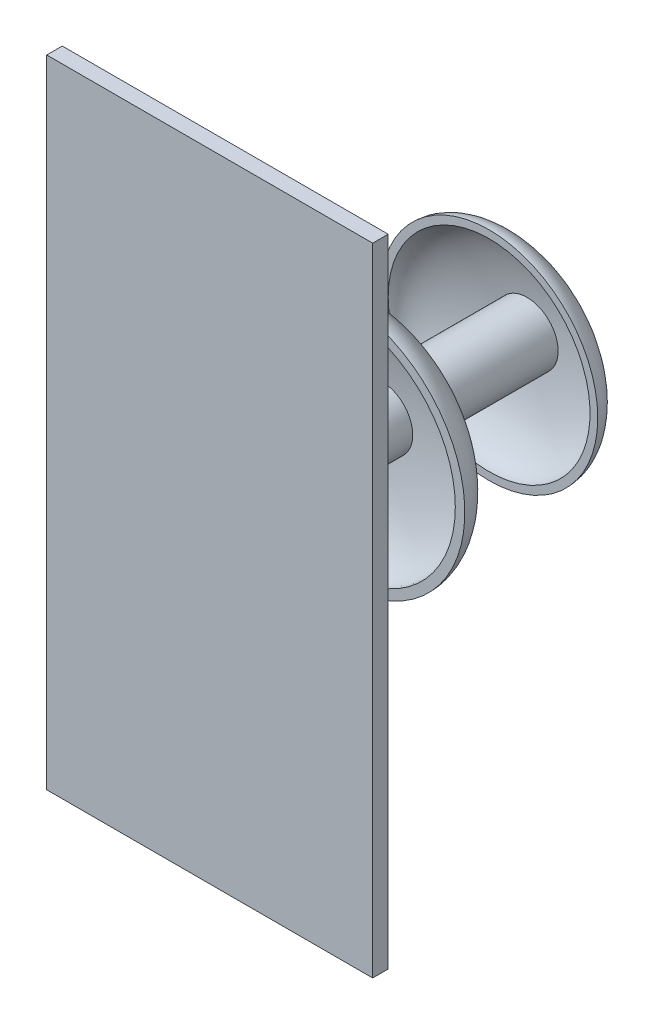
ISO-10303-21;
HEADER;
FILE_DESCRIPTION(('STEP AP214'),'2;1');
FILE_NAME('part.step','',(''),(''),'','','');
FILE_SCHEMA(('AUTOMOTIVE_DESIGN { 1 0 10303 214 1 1 1 1 }'));
ENDSEC;
DATA;
#1=APPLICATION_CONTEXT('core data for automotive mechanical design processes');
#2=APPLICATION_PROTOCOL_DEFINITION('international standard','automotive_design',2000,#1);
#3=PRODUCT_CONTEXT('',#1,'mechanical');
#4=PRODUCT('Part','Part','',(#3));
#5=PRODUCT_RELATED_PRODUCT_CATEGORY('part','',(#4));
#6=PRODUCT_DEFINITION_FORMATION('','',#4);
#7=PRODUCT_DEFINITION_CONTEXT('part definition',#1,'design');
#8=PRODUCT_DEFINITION('design','',#6,#7);
#9=PRODUCT_DEFINITION_SHAPE('','',#8);
#10=(LENGTH_UNIT() NAMED_UNIT(*) SI_UNIT(.MILLI.,.METRE.));
#11=(NAMED_UNIT(*) PLANE_ANGLE_UNIT() SI_UNIT($,.RADIAN.));
#12=(NAMED_UNIT(*) SI_UNIT($,.STERADIAN.) SOLID_ANGLE_UNIT());
#13=UNCERTAINTY_MEASURE_WITH_UNIT(LENGTH_MEASURE(1.E-05),#10,'distance_accuracy_value','');
#14=(GEOMETRIC_REPRESENTATION_CONTEXT(3) GLOBAL_UNCERTAINTY_ASSIGNED_CONTEXT((#13)) GLOBAL_UNIT_ASSIGNED_CONTEXT((#10,
#11,#12)) REPRESENTATION_CONTEXT('',''));
#15=CARTESIAN_POINT('',(0.,0.,0.));
#16=DIRECTION('',(0.,0.,1.));
#17=DIRECTION('',(1.,0.,0.));
#18=AXIS2_PLACEMENT_3D('',#15,#16,#17);
#19=CARTESIAN_POINT('',(0.,0.,0.1));
#20=DIRECTION('',(1.,0.,0.));
#21=DIRECTION('',(0.,1.,0.));
#22=AXIS2_PLACEMENT_3D('',#19,#20,#21);
#23=PLANE('',#22);
#24=DIRECTION('',(0.,-1.,0.));
#25=VECTOR('',#24,1.);
#26=CARTESIAN_POINT('',(0.,0.,0.));
#27=LINE('',#26,#25);
#28=CARTESIAN_POINT('',(0.,4.1,0.));
#29=VERTEX_POINT('',#28);
#30=CARTESIAN_POINT('',(0.,0.,0.));
#31=VERTEX_POINT('',#30);
#32=EDGE_CURVE('E124',#29,#31,#27,.T.);
#33=ORIENTED_EDGE('',*,*,#32,.T.);
#34=DIRECTION('',(0.,0.,-1.));
#35=VECTOR('',#34,1.);
#36=CARTESIAN_POINT('',(0.,0.,0.1));
#37=LINE('',#36,#35);
#38=CARTESIAN_POINT('',(0.,0.,0.1));
#39=VERTEX_POINT('',#38);
#40=EDGE_CURVE('E11',#39,#31,#37,.T.);
#41=ORIENTED_EDGE('',*,*,#40,.F.);
#42=DIRECTION('',(0.,-1.,0.));
#43=VECTOR('',#42,1.);
#44=CARTESIAN_POINT('',(0.,0.,0.1));
#45=LINE('',#44,#43);
#46=CARTESIAN_POINT('',(0.,4.1,0.1));
#47=VERTEX_POINT('',#46);
#48=EDGE_CURVE('E125',#47,#39,#45,.T.);
#49=ORIENTED_EDGE('',*,*,#48,.F.);
#50=DIRECTION('',(0.,0.,-1.));
#51=VECTOR('',#50,1.);
#52=CARTESIAN_POINT('',(0.,4.1,0.1));
#53=LINE('',#52,#51);
#54=EDGE_CURVE('E131',#47,#29,#53,.T.);
#55=ORIENTED_EDGE('',*,*,#54,.T.);
#56=EDGE_LOOP('',(#33,#41,#49,#55));
#57=FACE_BOUND('',#56,.T.);
#58=ADVANCED_FACE('F37',(#57),#23,.F.);
#59=CARTESIAN_POINT('',(0.,0.,0.1));
#60=DIRECTION('',(0.,1.,0.));
#61=DIRECTION('',(0.,0.,1.));
#62=AXIS2_PLACEMENT_3D('',#59,#60,#61);
#63=PLANE('',#62);
#64=DIRECTION('',(1.,0.,0.));
#65=VECTOR('',#64,1.);
#66=CARTESIAN_POINT('',(0.,0.,0.));
#67=LINE('',#66,#65);
#68=CARTESIAN_POINT('',(2.1,0.,0.));
#69=VERTEX_POINT('',#68);
#70=EDGE_CURVE('E134',#31,#69,#67,.T.);
#71=ORIENTED_EDGE('',*,*,#70,.T.);
#72=DIRECTION('',(0.,0.,-1.));
#73=VECTOR('',#72,1.);
#74=CARTESIAN_POINT('',(2.1,0.,0.1));
#75=LINE('',#74,#73);
#76=CARTESIAN_POINT('',(2.1,0.,0.1));
#77=VERTEX_POINT('',#76);
#78=EDGE_CURVE('E45',#77,#69,#75,.T.);
#79=ORIENTED_EDGE('',*,*,#78,.F.);
#80=DIRECTION('',(1.,0.,0.));
#81=VECTOR('',#80,1.);
#82=CARTESIAN_POINT('',(0.,0.,0.1));
#83=LINE('',#82,#81);
#84=EDGE_CURVE('E84',#39,#77,#83,.T.);
#85=ORIENTED_EDGE('',*,*,#84,.F.);
#86=ORIENTED_EDGE('',*,*,#40,.T.);
#87=EDGE_LOOP('',(#71,#79,#85,#86));
#88=FACE_BOUND('',#87,.T.);
#89=ADVANCED_FACE('F156',(#88),#63,.F.);
#90=CARTESIAN_POINT('',(2.1,0.,0.1));
#91=DIRECTION('',(-1.,0.,0.));
#92=DIRECTION('',(0.,-1.,0.));
#93=AXIS2_PLACEMENT_3D('',#90,#91,#92);
#94=PLANE('',#93);
#95=DIRECTION('',(0.,1.,0.));
#96=VECTOR('',#95,1.);
#97=CARTESIAN_POINT('',(2.1,0.,0.));
#98=LINE('',#97,#96);
#99=CARTESIAN_POINT('',(2.1,4.1,0.));
#100=VERTEX_POINT('',#99);
#101=EDGE_CURVE('E71',#69,#100,#98,.T.);
#102=ORIENTED_EDGE('',*,*,#101,.T.);
#103=DIRECTION('',(0.,0.,-1.));
#104=VECTOR('',#103,1.);
#105=CARTESIAN_POINT('',(2.1,4.1,0.1));
#106=LINE('',#105,#104);
#107=CARTESIAN_POINT('',(2.1,4.1,0.1));
#108=VERTEX_POINT('',#107);
#109=EDGE_CURVE('E139',#108,#100,#106,.T.);
#110=ORIENTED_EDGE('',*,*,#109,.F.);
#111=DIRECTION('',(0.,1.,0.));
#112=VECTOR('',#111,1.);
#113=CARTESIAN_POINT('',(2.1,0.,0.1));
#114=LINE('',#113,#112);
#115=EDGE_CURVE('E128',#77,#108,#114,.T.);
#116=ORIENTED_EDGE('',*,*,#115,.F.);
#117=ORIENTED_EDGE('',*,*,#78,.T.);
#118=EDGE_LOOP('',(#102,#110,#116,#117));
#119=FACE_BOUND('',#118,.T.);
#120=ADVANCED_FACE('F141',(#119),#94,.F.);
#121=CARTESIAN_POINT('',(0.,4.1,0.1));
#122=DIRECTION('',(0.,-1.,0.));
#123=DIRECTION('',(0.,0.,-1.));
#124=AXIS2_PLACEMENT_3D('',#121,#122,#123);
#125=PLANE('',#124);
#126=DIRECTION('',(-1.,0.,0.));
#127=VECTOR('',#126,1.);
#128=CARTESIAN_POINT('',(0.,4.1,0.));
#129=LINE('',#128,#127);
#130=EDGE_CURVE('E77',#100,#29,#129,.T.);
#131=ORIENTED_EDGE('',*,*,#130,.T.);
#132=ORIENTED_EDGE('',*,*,#54,.F.);
#133=DIRECTION('',(-1.,0.,0.));
#134=VECTOR('',#133,1.);
#135=CARTESIAN_POINT('',(0.,4.1,0.1));
#136=LINE('',#135,#134);
#137=EDGE_CURVE('E53',#108,#47,#136,.T.);
#138=ORIENTED_EDGE('',*,*,#137,.F.);
#139=ORIENTED_EDGE('',*,*,#109,.T.);
#140=EDGE_LOOP('',(#131,#132,#138,#139));
#141=FACE_BOUND('',#140,.T.);
#142=ADVANCED_FACE('F147',(#141),#125,.F.);
#143=CARTESIAN_POINT('',(0.,0.,0.1));
#144=DIRECTION('',(0.,0.,-1.));
#145=DIRECTION('',(-1.,0.,0.));
#146=AXIS2_PLACEMENT_3D('',#143,#144,#145);
#147=PLANE('',#146);
#148=ORIENTED_EDGE('',*,*,#48,.T.);
#149=ORIENTED_EDGE('',*,*,#84,.T.);
#150=ORIENTED_EDGE('',*,*,#115,.T.);
#151=ORIENTED_EDGE('',*,*,#137,.T.);
#152=EDGE_LOOP('',(#148,#149,#150,#151));
#153=FACE_BOUND('',#152,.T.);
#154=ADVANCED_FACE('F149',(#153),#147,.F.);
#155=CARTESIAN_POINT('',(0.,0.,0.));
#156=DIRECTION('',(0.,0.,-1.));
#157=DIRECTION('',(-1.,0.,0.));
#158=AXIS2_PLACEMENT_3D('',#155,#156,#157);
#159=PLANE('',#158);
#160=CARTESIAN_POINT('',(1.05,2.05,0.));
#161=DIRECTION('',(0.,0.,-1.));
#162=DIRECTION('',(-1.,0.,0.));
#163=AXIS2_PLACEMENT_3D('',#160,#161,#162);
#164=CIRCLE('',#163,0.2);
#165=CARTESIAN_POINT('',(0.849999999999999,2.05,0.));
#166=VERTEX_POINT('',#165);
#167=EDGE_CURVE('E121',#166,#166,#164,.T.);
#168=ORIENTED_EDGE('',*,*,#167,.F.);
#169=EDGE_LOOP('',(#168));
#170=FACE_BOUND('',#169,.T.);
#171=ORIENTED_EDGE('',*,*,#32,.F.);
#172=ORIENTED_EDGE('',*,*,#130,.F.);
#173=ORIENTED_EDGE('',*,*,#101,.F.);
#174=ORIENTED_EDGE('',*,*,#70,.F.);
#175=EDGE_LOOP('',(#171,#172,#173,#174));
#176=FACE_BOUND('',#175,.T.);
#177=ADVANCED_FACE('F92',(#170,#176),#159,.T.);
#178=CARTESIAN_POINT('',(1.05,2.05,-1.7));
#179=DIRECTION('',(0.,1.,0.));
#180=DIRECTION('',(1.,0.,0.));
#181=AXIS2_PLACEMENT_3D('',#178,#179,#180);
#182=ELLIPSE('',#181,0.7,0.3);
#183=TRIMMED_CURVE('',#182,(PARAMETER_VALUE(-1.5707963267949)),
(PARAMETER_VALUE(1.5707963267949)),.T.,.PARAMETER.);
#184=CARTESIAN_POINT('',(1.05,2.05,-2.));
#185=DIRECTION('',(0.,0.,-1.));
#186=AXIS1_PLACEMENT('',#184,#185);
#187=SURFACE_OF_REVOLUTION('',#183,#186);
#188=CARTESIAN_POINT('',(1.05,2.05,-2.));
#189=VERTEX_POINT('',#188);
#190=VERTEX_LOOP('',#189);
#191=FACE_BOUND('',#190,.T.);
#192=CARTESIAN_POINT('',(1.05,2.05,-1.7));
#193=DIRECTION('',(0.,0.,-1.));
#194=DIRECTION('',(-1.,0.,0.));
#195=AXIS2_PLACEMENT_3D('',#192,#193,#194);
#196=CIRCLE('',#195,0.700000000000001);
#197=CARTESIAN_POINT('',(0.349999999999998,2.05,-1.7));
#198=VERTEX_POINT('',#197);
#199=EDGE_CURVE('E96',#198,#198,#196,.T.);
#200=ORIENTED_EDGE('',*,*,#199,.T.);
#201=EDGE_LOOP('',(#200));
#202=FACE_BOUND('',#201,.T.);
#203=ADVANCED_FACE('F88',(#191,#202),#187,.T.);
#204=CARTESIAN_POINT('',(1.05,2.05,-2.));
#205=DIRECTION('',(0.,0.,-1.));
#206=DIRECTION('',(-1.,0.,0.));
#207=AXIS2_PLACEMENT_3D('',#204,#205,#206);
#208=CYLINDRICAL_SURFACE('',#207,0.2);
#209=CARTESIAN_POINT('',(1.05,2.05,-1.00798812434171));
#210=DIRECTION('',(0.,0.,-1.));
#211=DIRECTION('',(-1.,0.,0.));
#212=AXIS2_PLACEMENT_3D('',#209,#210,#211);
#213=CIRCLE('',#212,0.2);
#214=CARTESIAN_POINT('',(0.849999999999999,2.05,-1.00798812434171));
#215=VERTEX_POINT('',#214);
#216=EDGE_CURVE('E118',#215,#215,#213,.T.);
#217=ORIENTED_EDGE('',*,*,#216,.F.);
#218=EDGE_LOOP('',(#217));
#219=FACE_BOUND('',#218,.T.);
#220=ORIENTED_EDGE('',*,*,#167,.T.);
#221=EDGE_LOOP('',(#220));
#222=FACE_BOUND('',#221,.T.);
#223=ADVANCED_FACE('F91',(#219,#222),#208,.T.);
#224=CARTESIAN_POINT('',(1.05,2.05,-0.743607049487499));
#225=DIRECTION('',(0.,-1.,0.));
#226=DIRECTION('',(1.,0.,0.));
#227=AXIS2_PLACEMENT_3D('',#224,#225,#226);
#228=ELLIPSE('',#227,0.738788916979201,0.274635979010074);
#229=TRIMMED_CURVE('',#228,(PARAMETER_VALUE(4.71238898038469)),
(PARAMETER_VALUE(7.85398163397448)),.T.,.PARAMETER.);
#230=CARTESIAN_POINT('',(1.05,2.05,-2.));
#231=DIRECTION('',(0.,0.,-1.));
#232=AXIS1_PLACEMENT('',#230,#231);
#233=SURFACE_OF_REVOLUTION('',#229,#232);
#234=CARTESIAN_POINT('',(1.05,2.05,-0.743607049487499));
#235=DIRECTION('',(0.,0.,-1.));
#236=DIRECTION('',(-1.,0.,0.));
#237=AXIS2_PLACEMENT_3D('',#234,#235,#236);
#238=CIRCLE('',#237,0.738788916979201);
#239=CARTESIAN_POINT('',(0.311211083020798,2.05,-0.743607049487498));
#240=VERTEX_POINT('',#239);
#241=EDGE_CURVE('E115',#240,#240,#238,.T.);
#242=ORIENTED_EDGE('',*,*,#241,.F.);
#243=EDGE_LOOP('',(#242));
#244=FACE_BOUND('',#243,.T.);
#245=ORIENTED_EDGE('',*,*,#216,.T.);
#246=EDGE_LOOP('',(#245));
#247=FACE_BOUND('',#246,.T.);
#248=ADVANCED_FACE('F208',(#244,#247),#233,.T.);
#249=CARTESIAN_POINT('',(1.7887889169792,2.05,-0.743607049487499));
#250=DIRECTION('',(0.,0.,-1.));
#251=DIRECTION('',(-1.,0.,0.));
#252=AXIS2_PLACEMENT_3D('',#249,#250,#251);
#253=PLANE('',#252);
#254=CARTESIAN_POINT('',(1.05,2.05,-0.743607049487499));
#255=DIRECTION('',(0.,0.,-1.));
#256=DIRECTION('',(-1.,0.,0.));
#257=AXIS2_PLACEMENT_3D('',#254,#255,#256);
#258=CIRCLE('',#257,0.8);
#259=CARTESIAN_POINT('',(0.249999999999999,2.05,-0.743607049487498));
#260=VERTEX_POINT('',#259);
#261=EDGE_CURVE('E112',#260,#260,#258,.T.);
#262=ORIENTED_EDGE('',*,*,#261,.F.);
#263=EDGE_LOOP('',(#262));
#264=FACE_BOUND('',#263,.T.);
#265=ORIENTED_EDGE('',*,*,#241,.T.);
#266=EDGE_LOOP('',(#265));
#267=FACE_BOUND('',#266,.T.);
#268=ADVANCED_FACE('F218',(#264,#267),#253,.F.);
#269=CARTESIAN_POINT('',(1.05,2.05,-0.743607049487499));
#270=DIRECTION('',(0.,1.,0.));
#271=DIRECTION('',(1.,0.,0.));
#272=AXIS2_PLACEMENT_3D('',#269,#270,#271);
#273=ELLIPSE('',#272,0.8,0.375);
#274=TRIMMED_CURVE('',#273,(PARAMETER_VALUE(-1.5707963267949)),
(PARAMETER_VALUE(1.5707963267949)),.T.,.PARAMETER.);
#275=CARTESIAN_POINT('',(1.05,2.05,-2.));
#276=DIRECTION('',(0.,0.,-1.));
#277=AXIS1_PLACEMENT('',#275,#276);
#278=SURFACE_OF_REVOLUTION('',#274,#277);
#279=CARTESIAN_POINT('',(1.05,2.05,-1.10669923819444));
#280=DIRECTION('',(0.,0.,-1.));
#281=DIRECTION('',(-1.,0.,0.));
#282=AXIS2_PLACEMENT_3D('',#279,#280,#281);
#283=CIRCLE('',#282,0.200000000000001);
#284=CARTESIAN_POINT('',(0.849999999999998,2.05,-1.10669923819444));
#285=VERTEX_POINT('',#284);
#286=EDGE_CURVE('E109',#285,#285,#283,.T.);
#287=ORIENTED_EDGE('',*,*,#286,.F.);
#288=EDGE_LOOP('',(#287));
#289=FACE_BOUND('',#288,.T.);
#290=ORIENTED_EDGE('',*,*,#261,.T.);
#291=EDGE_LOOP('',(#290));
#292=FACE_BOUND('',#291,.T.);
#293=ADVANCED_FACE('F229',(#289,#292),#278,.T.);
#294=CARTESIAN_POINT('',(1.05,2.05,-2.));
#295=DIRECTION('',(0.,0.,-1.));
#296=DIRECTION('',(-1.,0.,0.));
#297=AXIS2_PLACEMENT_3D('',#294,#295,#296);
#298=CYLINDRICAL_SURFACE('',#297,0.200000000000001);
#299=CARTESIAN_POINT('',(1.05,2.05,-1.94480916412495));
#300=DIRECTION('',(0.,0.,-1.));
#301=DIRECTION('',(-1.,0.,0.));
#302=AXIS2_PLACEMENT_3D('',#299,#300,#301);
#303=CIRCLE('',#302,0.2);
#304=CARTESIAN_POINT('',(0.849999999999998,2.05,-1.94480916412495));
#305=VERTEX_POINT('',#304);
#306=EDGE_CURVE('E101',#305,#305,#303,.T.);
#307=ORIENTED_EDGE('',*,*,#306,.F.);
#308=EDGE_LOOP('',(#307));
#309=FACE_BOUND('',#308,.T.);
#310=ORIENTED_EDGE('',*,*,#286,.T.);
#311=EDGE_LOOP('',(#310));
#312=FACE_BOUND('',#311,.T.);
#313=ADVANCED_FACE('F240',(#309,#312),#298,.T.);
#314=CARTESIAN_POINT('',(1.05,2.05,-1.7));
#315=DIRECTION('',(0.,-1.,0.));
#316=DIRECTION('',(1.,0.,0.));
#317=AXIS2_PLACEMENT_3D('',#314,#315,#316);
#318=ELLIPSE('',#317,0.650157335562836,0.257284912237344);
#319=TRIMMED_CURVE('',#318,(PARAMETER_VALUE(4.71238898038469)),
(PARAMETER_VALUE(7.85398163397448)),.T.,.PARAMETER.);
#320=CARTESIAN_POINT('',(1.05,2.05,-2.));
#321=DIRECTION('',(0.,0.,-1.));
#322=AXIS1_PLACEMENT('',#320,#321);
#323=SURFACE_OF_REVOLUTION('',#319,#322);
#324=CARTESIAN_POINT('',(1.05,2.05,-1.7));
#325=DIRECTION('',(0.,0.,-1.));
#326=DIRECTION('',(-1.,0.,0.));
#327=AXIS2_PLACEMENT_3D('',#324,#325,#326);
#328=CIRCLE('',#327,0.650157335562837);
#329=CARTESIAN_POINT('',(0.399842664437162,2.05,-1.7));
#330=VERTEX_POINT('',#329);
#331=EDGE_CURVE('E98',#330,#330,#328,.T.);
#332=ORIENTED_EDGE('',*,*,#331,.F.);
#333=EDGE_LOOP('',(#332));
#334=FACE_BOUND('',#333,.T.);
#335=ORIENTED_EDGE('',*,*,#306,.T.);
#336=EDGE_LOOP('',(#335));
#337=FACE_BOUND('',#336,.T.);
#338=ADVANCED_FACE('F252',(#334,#337),#323,.T.);
#339=CARTESIAN_POINT('',(1.70015733556284,2.05,-1.7));
#340=DIRECTION('',(0.,0.,-1.));
#341=DIRECTION('',(-1.,0.,0.));
#342=AXIS2_PLACEMENT_3D('',#339,#340,#341);
#343=PLANE('',#342);
#344=ORIENTED_EDGE('',*,*,#199,.F.);
#345=EDGE_LOOP('',(#344));
#346=FACE_BOUND('',#345,.T.);
#347=ORIENTED_EDGE('',*,*,#331,.T.);
#348=EDGE_LOOP('',(#347));
#349=FACE_BOUND('',#348,.T.);
#350=ADVANCED_FACE('F262',(#346,#349),#343,.F.);
#351=CLOSED_SHELL('',(#58,#89,#120,#142,#154,#177,#203,#223,#248,#268,#293,#313,#338,#350));
#352=MANIFOLD_SOLID_BREP('B2',#351);
#353=ADVANCED_BREP_SHAPE_REPRESENTATION('',(#18,#352),#14);
#354=SHAPE_DEFINITION_REPRESENTATION(#9,#353);
ENDSEC;
END-ISO-10303-21;
